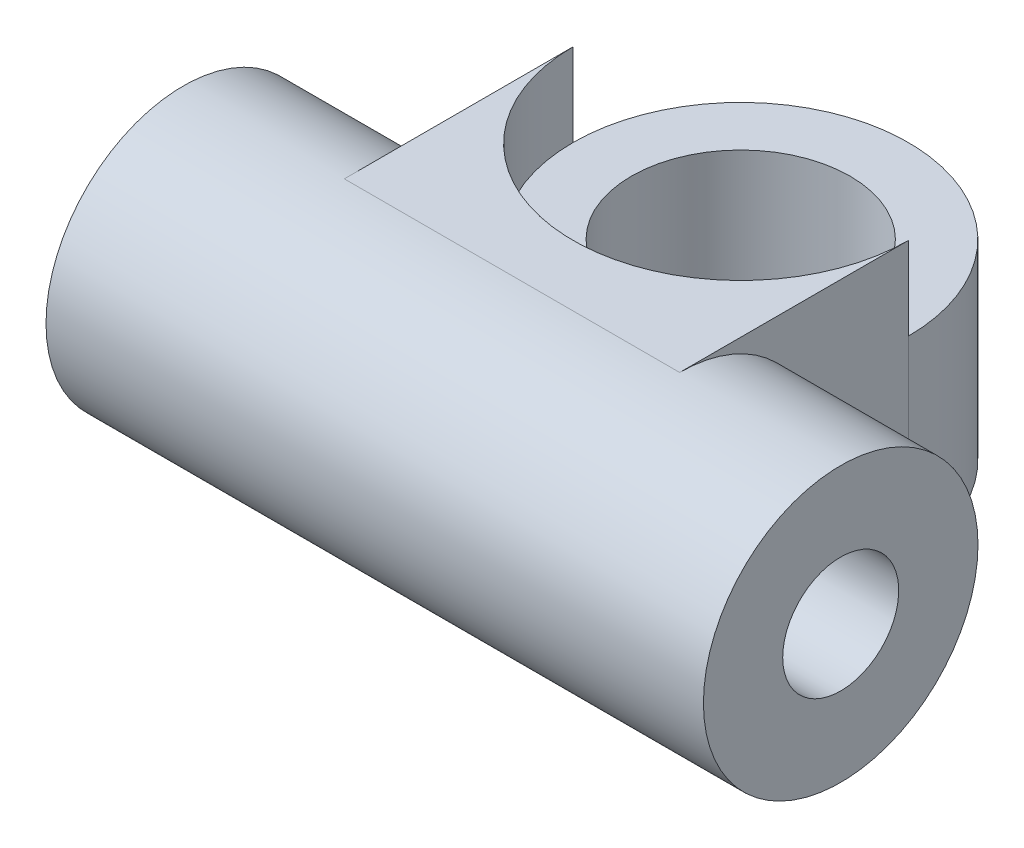
ISO-10303-21;
HEADER;
FILE_DESCRIPTION(('STEP AP214'),'2;1');
FILE_NAME('part.step','',(''),(''),'','','');
FILE_SCHEMA(('AUTOMOTIVE_DESIGN { 1 0 10303 214 1 1 1 1 }'));
ENDSEC;
DATA;
#1=APPLICATION_CONTEXT('core data for automotive mechanical design processes');
#2=APPLICATION_PROTOCOL_DEFINITION('international standard','automotive_design',2000,#1);
#3=PRODUCT_CONTEXT('',#1,'mechanical');
#4=PRODUCT('Part','Part','',(#3));
#5=PRODUCT_RELATED_PRODUCT_CATEGORY('part','',(#4));
#6=PRODUCT_DEFINITION_FORMATION('','',#4);
#7=PRODUCT_DEFINITION_CONTEXT('part definition',#1,'design');
#8=PRODUCT_DEFINITION('design','',#6,#7);
#9=PRODUCT_DEFINITION_SHAPE('','',#8);
#10=(LENGTH_UNIT() NAMED_UNIT(*) SI_UNIT(.MILLI.,.METRE.));
#11=(NAMED_UNIT(*) PLANE_ANGLE_UNIT() SI_UNIT($,.RADIAN.));
#12=(NAMED_UNIT(*) SI_UNIT($,.STERADIAN.) SOLID_ANGLE_UNIT());
#13=UNCERTAINTY_MEASURE_WITH_UNIT(LENGTH_MEASURE(1.E-05),#10,'distance_accuracy_value','');
#14=(GEOMETRIC_REPRESENTATION_CONTEXT(3) GLOBAL_UNCERTAINTY_ASSIGNED_CONTEXT((#13)) GLOBAL_UNIT_ASSIGNED_CONTEXT((#10,
#11,#12)) REPRESENTATION_CONTEXT('',''));
#15=CARTESIAN_POINT('',(0.,0.,0.));
#16=DIRECTION('',(0.,0.,1.));
#17=DIRECTION('',(1.,0.,0.));
#18=AXIS2_PLACEMENT_3D('',#15,#16,#17);
#19=CARTESIAN_POINT('',(5.95,2.485,-4.14));
#20=DIRECTION('',(0.,-1.,0.));
#21=DIRECTION('',(0.,0.,-1.));
#22=AXIS2_PLACEMENT_3D('',#19,#20,#21);
#23=CYLINDRICAL_SURFACE('',#22,3.035);
#24=CARTESIAN_POINT('',(5.95,0.985,-4.14));
#25=DIRECTION('',(0.,1.,0.));
#26=DIRECTION('',(0.,0.,1.));
#27=AXIS2_PLACEMENT_3D('',#24,#25,#26);
#28=CIRCLE('',#27,3.035);
#29=CARTESIAN_POINT('',(8.985,0.985,-4.14));
#30=VERTEX_POINT('',#29);
#31=CARTESIAN_POINT('',(2.915,0.985,-4.14));
#32=VERTEX_POINT('',#31);
#33=EDGE_CURVE('E142',#30,#32,#28,.T.);
#34=ORIENTED_EDGE('',*,*,#33,.F.);
#35=DIRECTION('',(0.,-1.,0.));
#36=VECTOR('',#35,1.);
#37=CARTESIAN_POINT('',(8.985,2.485,-4.14));
#38=LINE('',#37,#36);
#39=CARTESIAN_POINT('',(8.985,-2.485,-4.14));
#40=VERTEX_POINT('',#39);
#41=EDGE_CURVE('E100',#30,#40,#38,.T.);
#42=ORIENTED_EDGE('',*,*,#41,.T.);
#43=CARTESIAN_POINT('',(5.95,-2.485,-4.14));
#44=DIRECTION('',(0.,1.,0.));
#45=DIRECTION('',(0.,0.,1.));
#46=AXIS2_PLACEMENT_3D('',#43,#44,#45);
#47=CIRCLE('',#46,3.035);
#48=CARTESIAN_POINT('',(2.915,-2.485,-4.14));
#49=VERTEX_POINT('',#48);
#50=EDGE_CURVE('E119',#40,#49,#47,.T.);
#51=ORIENTED_EDGE('',*,*,#50,.T.);
#52=DIRECTION('',(0.,-1.,0.));
#53=VECTOR('',#52,1.);
#54=CARTESIAN_POINT('',(2.915,2.485,-4.14));
#55=LINE('',#54,#53);
#56=EDGE_CURVE('E115',#32,#49,#55,.T.);
#57=ORIENTED_EDGE('',*,*,#56,.F.);
#58=EDGE_LOOP('',(#34,#42,#51,#57));
#59=FACE_BOUND('',#58,.T.);
#60=ADVANCED_FACE('F38',(#59),#23,.T.);
#61=CARTESIAN_POINT('',(5.95,-2.485,-4.14));
#62=DIRECTION('',(0.,1.,0.));
#63=DIRECTION('',(0.,0.,1.));
#64=AXIS2_PLACEMENT_3D('',#61,#62,#63);
#65=CYLINDRICAL_SURFACE('',#64,1.98);
#66=CARTESIAN_POINT('',(5.95,-2.485,-4.14));
#67=DIRECTION('',(0.,1.,0.));
#68=DIRECTION('',(0.,0.,1.));
#69=AXIS2_PLACEMENT_3D('',#66,#67,#68);
#70=CIRCLE('',#69,1.98);
#71=CARTESIAN_POINT('',(5.95,-2.485,-2.16));
#72=VERTEX_POINT('',#71);
#73=EDGE_CURVE('E111',#72,#72,#70,.T.);
#74=ORIENTED_EDGE('',*,*,#73,.F.);
#75=EDGE_LOOP('',(#74));
#76=FACE_BOUND('',#75,.T.);
#77=CARTESIAN_POINT('',(5.95,0.985,-4.14));
#78=DIRECTION('',(0.,1.,0.));
#79=DIRECTION('',(0.,0.,1.));
#80=AXIS2_PLACEMENT_3D('',#77,#78,#79);
#81=CIRCLE('',#80,1.98);
#82=CARTESIAN_POINT('',(5.95,0.985,-2.16));
#83=VERTEX_POINT('',#82);
#84=EDGE_CURVE('E42',#83,#83,#81,.F.);
#85=ORIENTED_EDGE('',*,*,#84,.F.);
#86=EDGE_LOOP('',(#85));
#87=FACE_BOUND('',#86,.T.);
#88=ADVANCED_FACE('F162',(#76,#87),#65,.F.);
#89=CARTESIAN_POINT('',(11.9,0.,0.));
#90=DIRECTION('',(-1.,0.,0.));
#91=DIRECTION('',(0.,0.,1.));
#92=AXIS2_PLACEMENT_3D('',#89,#90,#91);
#93=CYLINDRICAL_SURFACE('',#92,2.485);
#94=CARTESIAN_POINT('',(8.985,0.,0.));
#95=DIRECTION('',(1.,0.,0.));
#96=DIRECTION('',(0.,0.,-1.));
#97=AXIS2_PLACEMENT_3D('',#94,#95,#96);
#98=CIRCLE('',#97,2.485);
#99=CARTESIAN_POINT('',(8.985,-2.485,0.));
#100=VERTEX_POINT('',#99);
#101=CARTESIAN_POINT('',(8.985,2.485,0.));
#102=VERTEX_POINT('',#101);
#103=EDGE_CURVE('E11',#100,#102,#98,.T.);
#104=ORIENTED_EDGE('',*,*,#103,.T.);
#105=DIRECTION('',(1.,0.,0.));
#106=VECTOR('',#105,1.);
#107=CARTESIAN_POINT('',(0.,2.485,0.));
#108=LINE('',#107,#106);
#109=CARTESIAN_POINT('',(2.915,2.485,0.));
#110=VERTEX_POINT('',#109);
#111=EDGE_CURVE('E56',#110,#102,#108,.T.);
#112=ORIENTED_EDGE('',*,*,#111,.F.);
#113=CARTESIAN_POINT('',(2.915,0.,0.));
#114=DIRECTION('',(1.,0.,0.));
#115=DIRECTION('',(0.,0.,-1.));
#116=AXIS2_PLACEMENT_3D('',#113,#114,#115);
#117=CIRCLE('',#116,2.485);
#118=CARTESIAN_POINT('',(2.915,-2.485,0.));
#119=VERTEX_POINT('',#118);
#120=EDGE_CURVE('E47',#119,#110,#117,.T.);
#121=ORIENTED_EDGE('',*,*,#120,.F.);
#122=DIRECTION('',(1.,0.,0.));
#123=VECTOR('',#122,1.);
#124=CARTESIAN_POINT('',(0.,-2.485,0.));
#125=LINE('',#124,#123);
#126=EDGE_CURVE('E105',#119,#100,#125,.T.);
#127=ORIENTED_EDGE('',*,*,#126,.T.);
#128=EDGE_LOOP('',(#104,#112,#121,#127));
#129=FACE_BOUND('',#128,.T.);
#130=CARTESIAN_POINT('',(11.9,0.,0.));
#131=DIRECTION('',(1.,0.,0.));
#132=DIRECTION('',(0.,0.,-1.));
#133=AXIS2_PLACEMENT_3D('',#130,#131,#132);
#134=CIRCLE('',#133,2.485);
#135=CARTESIAN_POINT('',(11.9,0.,-2.485));
#136=VERTEX_POINT('',#135);
#137=EDGE_CURVE('E125',#136,#136,#134,.T.);
#138=ORIENTED_EDGE('',*,*,#137,.F.);
#139=EDGE_LOOP('',(#138));
#140=FACE_BOUND('',#139,.T.);
#141=CARTESIAN_POINT('',(0.,0.,0.));
#142=DIRECTION('',(1.,0.,0.));
#143=DIRECTION('',(0.,0.,-1.));
#144=AXIS2_PLACEMENT_3D('',#141,#142,#143);
#145=CIRCLE('',#144,2.485);
#146=CARTESIAN_POINT('',(0.,0.,-2.485));
#147=VERTEX_POINT('',#146);
#148=EDGE_CURVE('E101',#147,#147,#145,.T.);
#149=ORIENTED_EDGE('',*,*,#148,.T.);
#150=EDGE_LOOP('',(#149));
#151=FACE_BOUND('',#150,.T.);
#152=ADVANCED_FACE('F40',(#129,#140,#151),#93,.T.);
#153=CARTESIAN_POINT('',(11.9,0.,0.));
#154=DIRECTION('',(1.,0.,0.));
#155=DIRECTION('',(0.,0.,-1.));
#156=AXIS2_PLACEMENT_3D('',#153,#154,#155);
#157=PLANE('',#156);
#158=CARTESIAN_POINT('',(11.9,0.,0.));
#159=DIRECTION('',(-1.,0.,0.));
#160=DIRECTION('',(0.,0.,1.));
#161=AXIS2_PLACEMENT_3D('',#158,#159,#160);
#162=CIRCLE('',#161,1.05);
#163=CARTESIAN_POINT('',(11.9,0.,1.05));
#164=VERTEX_POINT('',#163);
#165=EDGE_CURVE('E148',#164,#164,#162,.T.);
#166=ORIENTED_EDGE('',*,*,#165,.T.);
#167=EDGE_LOOP('',(#166));
#168=FACE_BOUND('',#167,.T.);
#169=ORIENTED_EDGE('',*,*,#137,.T.);
#170=EDGE_LOOP('',(#169));
#171=FACE_BOUND('',#170,.T.);
#172=ADVANCED_FACE('F158',(#168,#171),#157,.T.);
#173=CARTESIAN_POINT('',(0.,0.,0.));
#174=DIRECTION('',(1.,0.,0.));
#175=DIRECTION('',(0.,0.,-1.));
#176=AXIS2_PLACEMENT_3D('',#173,#174,#175);
#177=PLANE('',#176);
#178=CARTESIAN_POINT('',(0.,0.,0.));
#179=DIRECTION('',(-1.,0.,0.));
#180=DIRECTION('',(0.,0.,1.));
#181=AXIS2_PLACEMENT_3D('',#178,#179,#180);
#182=CIRCLE('',#181,1.05);
#183=CARTESIAN_POINT('',(0.,0.,1.05));
#184=VERTEX_POINT('',#183);
#185=EDGE_CURVE('E146',#184,#184,#182,.T.);
#186=ORIENTED_EDGE('',*,*,#185,.F.);
#187=EDGE_LOOP('',(#186));
#188=FACE_BOUND('',#187,.T.);
#189=ORIENTED_EDGE('',*,*,#148,.F.);
#190=EDGE_LOOP('',(#189));
#191=FACE_BOUND('',#190,.T.);
#192=ADVANCED_FACE('F155',(#188,#191),#177,.F.);
#193=CARTESIAN_POINT('',(8.985,2.485,0.));
#194=DIRECTION('',(1.,0.,0.));
#195=DIRECTION('',(0.,0.,-1.));
#196=AXIS2_PLACEMENT_3D('',#193,#194,#195);
#197=PLANE('',#196);
#198=ORIENTED_EDGE('',*,*,#103,.F.);
#199=DIRECTION('',(0.,0.,1.));
#200=VECTOR('',#199,1.);
#201=CARTESIAN_POINT('',(8.985,-2.485,0.));
#202=LINE('',#201,#200);
#203=EDGE_CURVE('E116',#40,#100,#202,.T.);
#204=ORIENTED_EDGE('',*,*,#203,.F.);
#205=ORIENTED_EDGE('',*,*,#41,.F.);
#206=CARTESIAN_POINT('',(8.985,2.485,-4.14));
#207=VERTEX_POINT('',#206);
#208=EDGE_CURVE('E84',#207,#30,#38,.T.);
#209=ORIENTED_EDGE('',*,*,#208,.F.);
#210=DIRECTION('',(0.,0.,1.));
#211=VECTOR('',#210,1.);
#212=CARTESIAN_POINT('',(8.985,2.485,0.));
#213=LINE('',#212,#211);
#214=EDGE_CURVE('E98',#207,#102,#213,.T.);
#215=ORIENTED_EDGE('',*,*,#214,.T.);
#216=EDGE_LOOP('',(#198,#204,#205,#209,#215));
#217=FACE_BOUND('',#216,.T.);
#218=ADVANCED_FACE('F97',(#217),#197,.T.);
#219=CARTESIAN_POINT('',(2.915,2.485,0.));
#220=DIRECTION('',(1.,0.,0.));
#221=DIRECTION('',(0.,0.,-1.));
#222=AXIS2_PLACEMENT_3D('',#219,#220,#221);
#223=PLANE('',#222);
#224=DIRECTION('',(0.,0.,1.));
#225=VECTOR('',#224,1.);
#226=CARTESIAN_POINT('',(2.915,-2.485,0.));
#227=LINE('',#226,#225);
#228=EDGE_CURVE('E108',#49,#119,#227,.T.);
#229=ORIENTED_EDGE('',*,*,#228,.T.);
#230=ORIENTED_EDGE('',*,*,#120,.T.);
#231=DIRECTION('',(0.,0.,1.));
#232=VECTOR('',#231,1.);
#233=CARTESIAN_POINT('',(2.915,2.485,0.));
#234=LINE('',#233,#232);
#235=CARTESIAN_POINT('',(2.915,2.485,-4.14));
#236=VERTEX_POINT('',#235);
#237=EDGE_CURVE('E104',#236,#110,#234,.T.);
#238=ORIENTED_EDGE('',*,*,#237,.F.);
#239=EDGE_CURVE('E87',#236,#32,#55,.T.);
#240=ORIENTED_EDGE('',*,*,#239,.T.);
#241=ORIENTED_EDGE('',*,*,#56,.T.);
#242=EDGE_LOOP('',(#229,#230,#238,#240,#241));
#243=FACE_BOUND('',#242,.T.);
#244=ADVANCED_FACE('F131',(#243),#223,.F.);
#245=CARTESIAN_POINT('',(0.,2.485,0.));
#246=DIRECTION('',(0.,1.,0.));
#247=DIRECTION('',(0.,0.,1.));
#248=AXIS2_PLACEMENT_3D('',#245,#246,#247);
#249=PLANE('',#248);
#250=CARTESIAN_POINT('',(5.95,2.485,-4.14));
#251=DIRECTION('',(0.,1.,0.));
#252=DIRECTION('',(0.,0.,1.));
#253=AXIS2_PLACEMENT_3D('',#250,#251,#252);
#254=CIRCLE('',#253,3.035);
#255=EDGE_CURVE('E81',#236,#207,#254,.T.);
#256=ORIENTED_EDGE('',*,*,#255,.F.);
#257=ORIENTED_EDGE('',*,*,#237,.T.);
#258=ORIENTED_EDGE('',*,*,#111,.T.);
#259=ORIENTED_EDGE('',*,*,#214,.F.);
#260=EDGE_LOOP('',(#256,#257,#258,#259));
#261=FACE_BOUND('',#260,.T.);
#262=ADVANCED_FACE('F103',(#261),#249,.T.);
#263=CARTESIAN_POINT('',(0.,-2.485,0.));
#264=DIRECTION('',(0.,1.,0.));
#265=DIRECTION('',(0.,0.,1.));
#266=AXIS2_PLACEMENT_3D('',#263,#264,#265);
#267=PLANE('',#266);
#268=ORIENTED_EDGE('',*,*,#73,.T.);
#269=EDGE_LOOP('',(#268));
#270=FACE_BOUND('',#269,.T.);
#271=ORIENTED_EDGE('',*,*,#203,.T.);
#272=ORIENTED_EDGE('',*,*,#126,.F.);
#273=ORIENTED_EDGE('',*,*,#228,.F.);
#274=ORIENTED_EDGE('',*,*,#50,.F.);
#275=EDGE_LOOP('',(#271,#272,#273,#274));
#276=FACE_BOUND('',#275,.T.);
#277=ADVANCED_FACE('F137',(#270,#276),#267,.F.);
#278=CARTESIAN_POINT('',(11.9,0.,0.));
#279=DIRECTION('',(-1.,0.,0.));
#280=DIRECTION('',(0.,0.,1.));
#281=AXIS2_PLACEMENT_3D('',#278,#279,#280);
#282=CYLINDRICAL_SURFACE('',#281,1.05);
#283=ORIENTED_EDGE('',*,*,#165,.F.);
#284=EDGE_LOOP('',(#283));
#285=FACE_BOUND('',#284,.T.);
#286=ORIENTED_EDGE('',*,*,#185,.T.);
#287=EDGE_LOOP('',(#286));
#288=FACE_BOUND('',#287,.T.);
#289=ADVANCED_FACE('F153',(#285,#288),#282,.F.);
#290=CARTESIAN_POINT('',(5.95,0.985,-4.14));
#291=DIRECTION('',(0.,1.,0.));
#292=DIRECTION('',(0.,0.,1.));
#293=AXIS2_PLACEMENT_3D('',#290,#291,#292);
#294=CYLINDRICAL_SURFACE('',#293,3.035);
#295=EDGE_CURVE('E92',#32,#30,#28,.T.);
#296=ORIENTED_EDGE('',*,*,#295,.F.);
#297=ORIENTED_EDGE('',*,*,#239,.F.);
#298=ORIENTED_EDGE('',*,*,#255,.T.);
#299=ORIENTED_EDGE('',*,*,#208,.T.);
#300=EDGE_LOOP('',(#296,#297,#298,#299));
#301=FACE_BOUND('',#300,.T.);
#302=ADVANCED_FACE('F83',(#301),#294,.F.);
#303=CARTESIAN_POINT('',(5.95,0.985,-4.14));
#304=DIRECTION('',(0.,1.,0.));
#305=DIRECTION('',(0.,0.,1.));
#306=AXIS2_PLACEMENT_3D('',#303,#304,#305);
#307=PLANE('',#306);
#308=ORIENTED_EDGE('',*,*,#33,.T.);
#309=ORIENTED_EDGE('',*,*,#295,.T.);
#310=EDGE_LOOP('',(#308,#309));
#311=FACE_BOUND('',#310,.T.);
#312=ORIENTED_EDGE('',*,*,#84,.T.);
#313=EDGE_LOOP('',(#312));
#314=FACE_BOUND('',#313,.T.);
#315=ADVANCED_FACE('F196',(#311,#314),#307,.T.);
#316=CLOSED_SHELL('',(#60,#88,#152,#172,#192,#218,#244,#262,#277,#289,#302,#315));
#317=MANIFOLD_SOLID_BREP('B2',#316);
#318=ADVANCED_BREP_SHAPE_REPRESENTATION('',(#18,#317),#14);
#319=SHAPE_DEFINITION_REPRESENTATION(#9,#318);
ENDSEC;
END-ISO-10303-21;
